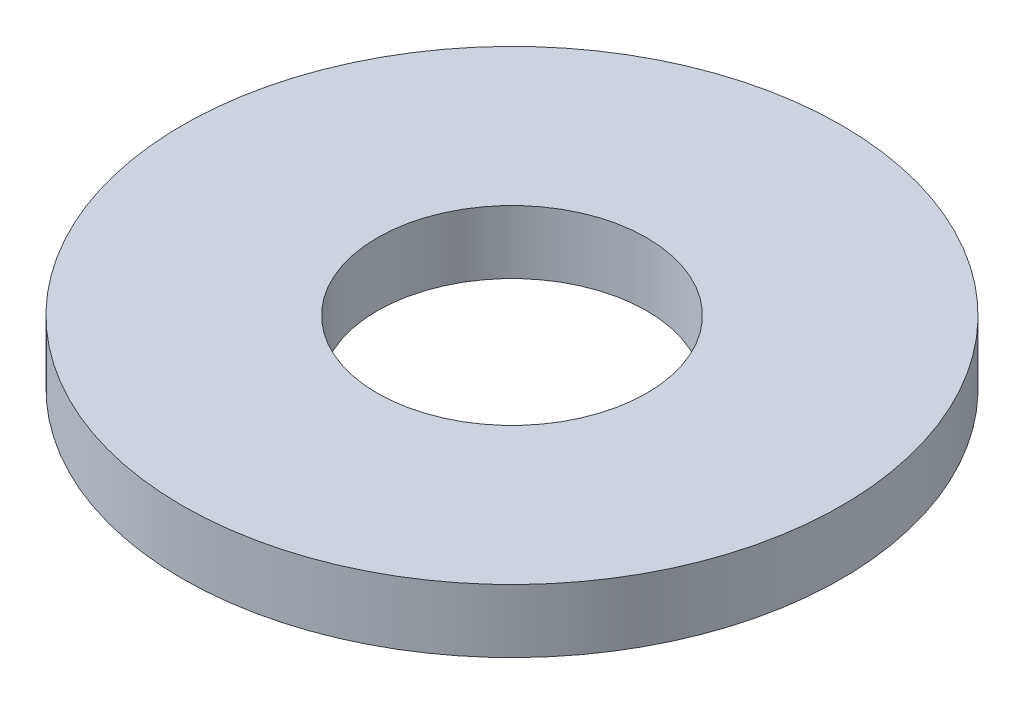
ISO-10303-21;
HEADER;
FILE_DESCRIPTION(('STEP AP214'),'2;1');
FILE_NAME('part.step','',(''),(''),'','','');
FILE_SCHEMA(('AUTOMOTIVE_DESIGN { 1 0 10303 214 1 1 1 1 }'));
ENDSEC;
DATA;
#1=APPLICATION_CONTEXT('core data for automotive mechanical design processes');
#2=APPLICATION_PROTOCOL_DEFINITION('international standard','automotive_design',2000,#1);
#3=PRODUCT_CONTEXT('',#1,'mechanical');
#4=PRODUCT('Part','Part','',(#3));
#5=PRODUCT_RELATED_PRODUCT_CATEGORY('part','',(#4));
#6=PRODUCT_DEFINITION_FORMATION('','',#4);
#7=PRODUCT_DEFINITION_CONTEXT('part definition',#1,'design');
#8=PRODUCT_DEFINITION('design','',#6,#7);
#9=PRODUCT_DEFINITION_SHAPE('','',#8);
#10=(LENGTH_UNIT() NAMED_UNIT(*) SI_UNIT(.MILLI.,.METRE.));
#11=(NAMED_UNIT(*) PLANE_ANGLE_UNIT() SI_UNIT($,.RADIAN.));
#12=(NAMED_UNIT(*) SI_UNIT($,.STERADIAN.) SOLID_ANGLE_UNIT());
#13=UNCERTAINTY_MEASURE_WITH_UNIT(LENGTH_MEASURE(1.E-05),#10,'distance_accuracy_value','');
#14=(GEOMETRIC_REPRESENTATION_CONTEXT(3) GLOBAL_UNCERTAINTY_ASSIGNED_CONTEXT((#13)) GLOBAL_UNIT_ASSIGNED_CONTEXT((#10,
#11,#12)) REPRESENTATION_CONTEXT('',''));
#15=CARTESIAN_POINT('',(0.,0.,0.));
#16=DIRECTION('',(0.,0.,1.));
#17=DIRECTION('',(1.,0.,0.));
#18=AXIS2_PLACEMENT_3D('',#15,#16,#17);
#19=CARTESIAN_POINT('',(0.,3.3528,0.));
#20=DIRECTION('',(0.,-1.,0.));
#21=DIRECTION('',(0.,0.,-1.));
#22=AXIS2_PLACEMENT_3D('',#19,#20,#21);
#23=CYLINDRICAL_SURFACE('',#22,17.4625);
#24=CARTESIAN_POINT('',(0.,3.3528,0.));
#25=DIRECTION('',(0.,1.,0.));
#26=DIRECTION('',(0.,0.,1.));
#27=AXIS2_PLACEMENT_3D('',#24,#25,#26);
#28=CIRCLE('',#27,17.4625);
#29=CARTESIAN_POINT('',(0.,3.3528,17.4625));
#30=VERTEX_POINT('',#29);
#31=EDGE_CURVE('E10',#30,#30,#28,.T.);
#32=ORIENTED_EDGE('',*,*,#31,.F.);
#33=EDGE_LOOP('',(#32));
#34=FACE_BOUND('',#33,.T.);
#35=CARTESIAN_POINT('',(0.,0.,0.));
#36=DIRECTION('',(0.,1.,0.));
#37=DIRECTION('',(0.,0.,1.));
#38=AXIS2_PLACEMENT_3D('',#35,#36,#37);
#39=CIRCLE('',#38,17.4625);
#40=CARTESIAN_POINT('',(0.,0.,17.4625));
#41=VERTEX_POINT('',#40);
#42=EDGE_CURVE('E33',#41,#41,#39,.T.);
#43=ORIENTED_EDGE('',*,*,#42,.T.);
#44=EDGE_LOOP('',(#43));
#45=FACE_BOUND('',#44,.T.);
#46=ADVANCED_FACE('F30',(#34,#45),#23,.T.);
#47=CARTESIAN_POINT('',(0.,3.3528,0.));
#48=DIRECTION('',(0.,1.,0.));
#49=DIRECTION('',(0.,0.,1.));
#50=AXIS2_PLACEMENT_3D('',#47,#48,#49);
#51=PLANE('',#50);
#52=CARTESIAN_POINT('',(0.,3.3528,0.));
#53=DIRECTION('',(0.,1.,0.));
#54=DIRECTION('',(0.,0.,1.));
#55=AXIS2_PLACEMENT_3D('',#52,#53,#54);
#56=CIRCLE('',#55,7.1374);
#57=CARTESIAN_POINT('',(0.,3.3528,7.1374));
#58=VERTEX_POINT('',#57);
#59=EDGE_CURVE('E42',#58,#58,#56,.T.);
#60=ORIENTED_EDGE('',*,*,#59,.F.);
#61=EDGE_LOOP('',(#60));
#62=FACE_BOUND('',#61,.T.);
#63=ORIENTED_EDGE('',*,*,#31,.T.);
#64=EDGE_LOOP('',(#63));
#65=FACE_BOUND('',#64,.T.);
#66=ADVANCED_FACE('F57',(#62,#65),#51,.T.);
#67=CARTESIAN_POINT('',(0.,0.,0.));
#68=DIRECTION('',(0.,1.,0.));
#69=DIRECTION('',(0.,0.,1.));
#70=AXIS2_PLACEMENT_3D('',#67,#68,#69);
#71=PLANE('',#70);
#72=CARTESIAN_POINT('',(0.,0.,0.));
#73=DIRECTION('',(0.,1.,0.));
#74=DIRECTION('',(0.,0.,1.));
#75=AXIS2_PLACEMENT_3D('',#72,#73,#74);
#76=CIRCLE('',#75,7.1374);
#77=CARTESIAN_POINT('',(0.,0.,7.1374));
#78=VERTEX_POINT('',#77);
#79=EDGE_CURVE('E40',#78,#78,#76,.T.);
#80=ORIENTED_EDGE('',*,*,#79,.T.);
#81=EDGE_LOOP('',(#80));
#82=FACE_BOUND('',#81,.T.);
#83=ORIENTED_EDGE('',*,*,#42,.F.);
#84=EDGE_LOOP('',(#83));
#85=FACE_BOUND('',#84,.T.);
#86=ADVANCED_FACE('F48',(#82,#85),#71,.F.);
#87=CARTESIAN_POINT('',(0.,0.,0.));
#88=DIRECTION('',(0.,1.,0.));
#89=DIRECTION('',(0.,0.,1.));
#90=AXIS2_PLACEMENT_3D('',#87,#88,#89);
#91=CYLINDRICAL_SURFACE('',#90,7.1374);
#92=ORIENTED_EDGE('',*,*,#79,.F.);
#93=EDGE_LOOP('',(#92));
#94=FACE_BOUND('',#93,.T.);
#95=ORIENTED_EDGE('',*,*,#59,.T.);
#96=EDGE_LOOP('',(#95));
#97=FACE_BOUND('',#96,.T.);
#98=ADVANCED_FACE('F51',(#94,#97),#91,.F.);
#99=CLOSED_SHELL('',(#46,#66,#86,#98));
#100=MANIFOLD_SOLID_BREP('B2',#99);
#101=ADVANCED_BREP_SHAPE_REPRESENTATION('',(#18,#100),#14);
#102=SHAPE_DEFINITION_REPRESENTATION(#9,#101);
ENDSEC;
END-ISO-10303-21;
